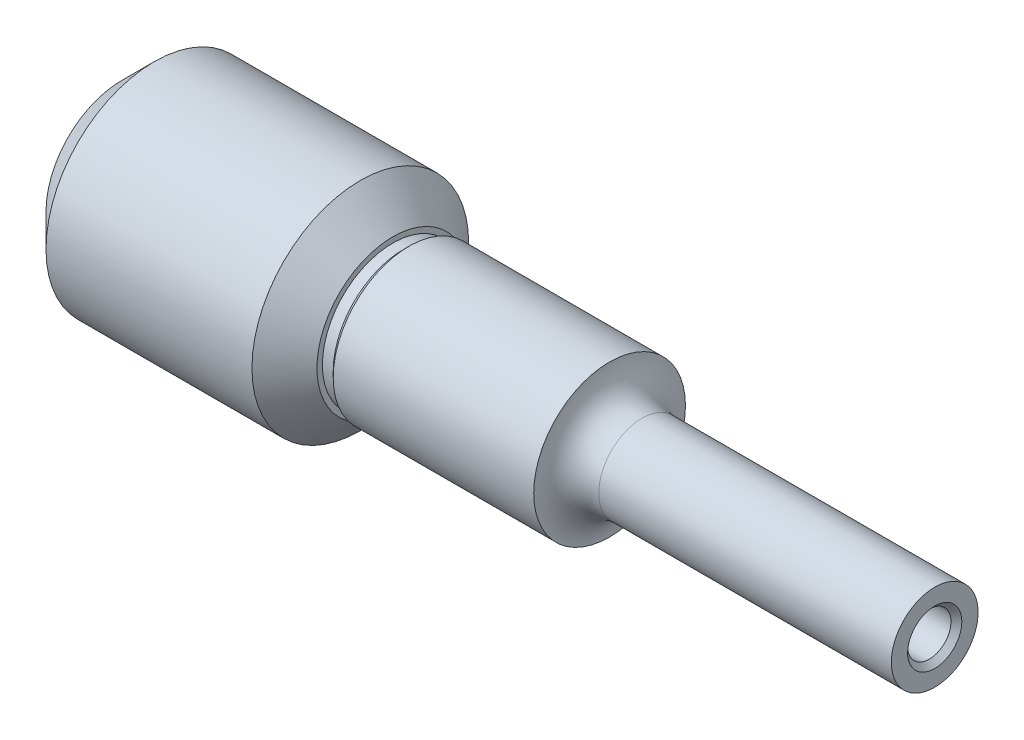
ISO-10303-21;
HEADER;
FILE_DESCRIPTION(('STEP AP214'),'2;1');
FILE_NAME('part.step','',(''),(''),'','','');
FILE_SCHEMA(('AUTOMOTIVE_DESIGN { 1 0 10303 214 1 1 1 1 }'));
ENDSEC;
DATA;
#1=APPLICATION_CONTEXT('core data for automotive mechanical design processes');
#2=APPLICATION_PROTOCOL_DEFINITION('international standard','automotive_design',2000,#1);
#3=PRODUCT_CONTEXT('',#1,'mechanical');
#4=PRODUCT('Part','Part','',(#3));
#5=PRODUCT_RELATED_PRODUCT_CATEGORY('part','',(#4));
#6=PRODUCT_DEFINITION_FORMATION('','',#4);
#7=PRODUCT_DEFINITION_CONTEXT('part definition',#1,'design');
#8=PRODUCT_DEFINITION('design','',#6,#7);
#9=PRODUCT_DEFINITION_SHAPE('','',#8);
#10=(LENGTH_UNIT() NAMED_UNIT(*) SI_UNIT(.MILLI.,.METRE.));
#11=(NAMED_UNIT(*) PLANE_ANGLE_UNIT() SI_UNIT($,.RADIAN.));
#12=(NAMED_UNIT(*) SI_UNIT($,.STERADIAN.) SOLID_ANGLE_UNIT());
#13=UNCERTAINTY_MEASURE_WITH_UNIT(LENGTH_MEASURE(1.E-05),#10,'distance_accuracy_value','');
#14=(GEOMETRIC_REPRESENTATION_CONTEXT(3) GLOBAL_UNCERTAINTY_ASSIGNED_CONTEXT((#13)) GLOBAL_UNIT_ASSIGNED_CONTEXT((#10,
#11,#12)) REPRESENTATION_CONTEXT('',''));
#15=CARTESIAN_POINT('',(0.,0.,0.));
#16=DIRECTION('',(0.,0.,1.));
#17=DIRECTION('',(1.,0.,0.));
#18=AXIS2_PLACEMENT_3D('',#15,#16,#17);
#19=CARTESIAN_POINT('',(96.,0.,0.));
#20=DIRECTION('',(1.,0.,0.));
#21=DIRECTION('',(0.,0.,-1.));
#22=AXIS2_PLACEMENT_3D('',#19,#20,#21);
#23=TOROIDAL_SURFACE('',#22,14.,6.);
#24=CARTESIAN_POINT('',(90.,0.,0.));
#25=DIRECTION('',(-1.,0.,0.));
#26=DIRECTION('',(0.,0.,1.));
#27=AXIS2_PLACEMENT_3D('',#24,#25,#26);
#28=CIRCLE('',#27,14.);
#29=CARTESIAN_POINT('',(90.,0.,14.));
#30=VERTEX_POINT('',#29);
#31=EDGE_CURVE('E78',#30,#30,#28,.T.);
#32=ORIENTED_EDGE('',*,*,#31,.F.);
#33=EDGE_LOOP('',(#32));
#34=FACE_BOUND('',#33,.T.);
#35=CARTESIAN_POINT('',(96.,0.,0.));
#36=DIRECTION('',(1.,0.,0.));
#37=DIRECTION('',(0.,0.,-1.));
#38=AXIS2_PLACEMENT_3D('',#35,#36,#37);
#39=CIRCLE('',#38,8.);
#40=CARTESIAN_POINT('',(96.,0.,-8.));
#41=VERTEX_POINT('',#40);
#42=EDGE_CURVE('E41',#41,#41,#39,.T.);
#43=ORIENTED_EDGE('',*,*,#42,.F.);
#44=EDGE_LOOP('',(#43));
#45=FACE_BOUND('',#44,.T.);
#46=ADVANCED_FACE('F33',(#34,#45),#23,.F.);
#47=CARTESIAN_POINT('',(36.,-10.,0.));
#48=DIRECTION('',(-1.,0.,0.));
#49=DIRECTION('',(0.,0.,1.));
#50=AXIS2_PLACEMENT_3D('',#47,#48,#49);
#51=PLANE('',#50);
#52=CARTESIAN_POINT('',(36.,0.,0.));
#53=DIRECTION('',(-1.,0.,0.));
#54=DIRECTION('',(0.,0.,1.));
#55=AXIS2_PLACEMENT_3D('',#52,#53,#54);
#56=CIRCLE('',#55,10.);
#57=CARTESIAN_POINT('',(36.,0.,10.));
#58=VERTEX_POINT('',#57);
#59=EDGE_CURVE('E87',#58,#58,#56,.T.);
#60=ORIENTED_EDGE('',*,*,#59,.T.);
#61=EDGE_LOOP('',(#60));
#62=FACE_BOUND('',#61,.T.);
#63=ADVANCED_FACE('F91',(#62),#51,.T.);
#64=CARTESIAN_POINT('',(125.,-4.,0.));
#65=DIRECTION('',(1.,0.,0.));
#66=DIRECTION('',(0.,0.,-1.));
#67=AXIS2_PLACEMENT_3D('',#64,#65,#66);
#68=PLANE('',#67);
#69=CARTESIAN_POINT('',(125.,0.,0.));
#70=DIRECTION('',(-1.,0.,0.));
#71=DIRECTION('',(0.,0.,1.));
#72=AXIS2_PLACEMENT_3D('',#69,#70,#71);
#73=CIRCLE('',#72,4.);
#74=CARTESIAN_POINT('',(125.,0.,4.));
#75=VERTEX_POINT('',#74);
#76=EDGE_CURVE('E72',#75,#75,#73,.T.);
#77=ORIENTED_EDGE('',*,*,#76,.F.);
#78=EDGE_LOOP('',(#77));
#79=FACE_BOUND('',#78,.T.);
#80=ADVANCED_FACE('F114',(#79),#68,.T.);
#81=CARTESIAN_POINT('',(0.,0.,0.));
#82=DIRECTION('',(-1.,0.,0.));
#83=DIRECTION('',(0.,0.,1.));
#84=AXIS2_PLACEMENT_3D('',#81,#82,#83);
#85=CYLINDRICAL_SURFACE('',#84,4.);
#86=CARTESIAN_POINT('',(149.,0.,0.));
#87=DIRECTION('',(1.,0.,0.));
#88=DIRECTION('',(0.,0.,-1.));
#89=AXIS2_PLACEMENT_3D('',#86,#87,#88);
#90=CIRCLE('',#89,4.);
#91=CARTESIAN_POINT('',(149.,0.,-4.));
#92=VERTEX_POINT('',#91);
#93=EDGE_CURVE('E45',#92,#92,#90,.T.);
#94=ORIENTED_EDGE('',*,*,#93,.T.);
#95=EDGE_LOOP('',(#94));
#96=FACE_BOUND('',#95,.T.);
#97=ORIENTED_EDGE('',*,*,#76,.T.);
#98=EDGE_LOOP('',(#97));
#99=FACE_BOUND('',#98,.T.);
#100=ADVANCED_FACE('F144',(#96,#99),#85,.F.);
#101=CARTESIAN_POINT('',(150.,-4.,0.));
#102=DIRECTION('',(1.,0.,0.));
#103=DIRECTION('',(0.,0.,-1.));
#104=AXIS2_PLACEMENT_3D('',#101,#102,#103);
#105=PLANE('',#104);
#106=CARTESIAN_POINT('',(150.,0.,0.));
#107=DIRECTION('',(1.,0.,0.));
#108=DIRECTION('',(0.,0.,-1.));
#109=AXIS2_PLACEMENT_3D('',#106,#107,#108);
#110=CIRCLE('',#109,4.99999999999998);
#111=CARTESIAN_POINT('',(150.,0.,-4.99999999999998));
#112=VERTEX_POINT('',#111);
#113=EDGE_CURVE('E49',#112,#112,#110,.F.);
#114=ORIENTED_EDGE('',*,*,#113,.T.);
#115=EDGE_LOOP('',(#114));
#116=FACE_BOUND('',#115,.T.);
#117=CARTESIAN_POINT('',(150.,0.,0.));
#118=DIRECTION('',(-1.,0.,0.));
#119=DIRECTION('',(0.,0.,1.));
#120=AXIS2_PLACEMENT_3D('',#117,#118,#119);
#121=CIRCLE('',#120,8.);
#122=CARTESIAN_POINT('',(150.,0.,8.));
#123=VERTEX_POINT('',#122);
#124=EDGE_CURVE('E75',#123,#123,#121,.T.);
#125=ORIENTED_EDGE('',*,*,#124,.F.);
#126=EDGE_LOOP('',(#125));
#127=FACE_BOUND('',#126,.T.);
#128=ADVANCED_FACE('F148',(#116,#127),#105,.T.);
#129=CARTESIAN_POINT('',(0.,0.,0.));
#130=DIRECTION('',(-1.,0.,0.));
#131=DIRECTION('',(0.,0.,1.));
#132=AXIS2_PLACEMENT_3D('',#129,#130,#131);
#133=CYLINDRICAL_SURFACE('',#132,8.);
#134=ORIENTED_EDGE('',*,*,#42,.T.);
#135=EDGE_LOOP('',(#134));
#136=FACE_BOUND('',#135,.T.);
#137=ORIENTED_EDGE('',*,*,#124,.T.);
#138=EDGE_LOOP('',(#137));
#139=FACE_BOUND('',#138,.T.);
#140=ADVANCED_FACE('F152',(#136,#139),#133,.T.);
#141=CARTESIAN_POINT('',(0.,0.,0.));
#142=DIRECTION('',(-1.,0.,0.));
#143=DIRECTION('',(0.,0.,1.));
#144=AXIS2_PLACEMENT_3D('',#141,#142,#143);
#145=CYLINDRICAL_SURFACE('',#144,14.);
#146=CARTESIAN_POINT('',(53.,0.,0.));
#147=DIRECTION('',(-1.,0.,0.));
#148=DIRECTION('',(0.,0.,1.));
#149=AXIS2_PLACEMENT_3D('',#146,#147,#148);
#150=CIRCLE('',#149,14.);
#151=CARTESIAN_POINT('',(53.,0.,14.));
#152=VERTEX_POINT('',#151);
#153=EDGE_CURVE('E10',#152,#152,#150,.F.);
#154=ORIENTED_EDGE('',*,*,#153,.T.);
#155=EDGE_LOOP('',(#154));
#156=FACE_BOUND('',#155,.T.);
#157=ORIENTED_EDGE('',*,*,#31,.T.);
#158=EDGE_LOOP('',(#157));
#159=FACE_BOUND('',#158,.T.);
#160=ADVANCED_FACE('F156',(#156,#159),#145,.T.);
#161=CARTESIAN_POINT('',(0.,0.,0.));
#162=DIRECTION('',(-1.,0.,0.));
#163=DIRECTION('',(0.,0.,1.));
#164=AXIS2_PLACEMENT_3D('',#161,#162,#163);
#165=CYLINDRICAL_SURFACE('',#164,13.);
#166=CARTESIAN_POINT('',(52.,0.,0.));
#167=DIRECTION('',(-1.,0.,0.));
#168=DIRECTION('',(0.,0.,1.));
#169=AXIS2_PLACEMENT_3D('',#166,#167,#168);
#170=CIRCLE('',#169,13.);
#171=CARTESIAN_POINT('',(52.,0.,13.));
#172=VERTEX_POINT('',#171);
#173=EDGE_CURVE('E81',#172,#172,#170,.T.);
#174=ORIENTED_EDGE('',*,*,#173,.T.);
#175=EDGE_LOOP('',(#174));
#176=FACE_BOUND('',#175,.T.);
#177=CARTESIAN_POINT('',(50.,0.,0.));
#178=DIRECTION('',(-1.,0.,0.));
#179=DIRECTION('',(0.,0.,1.));
#180=AXIS2_PLACEMENT_3D('',#177,#178,#179);
#181=CIRCLE('',#180,13.);
#182=CARTESIAN_POINT('',(50.,0.,13.));
#183=VERTEX_POINT('',#182);
#184=EDGE_CURVE('E84',#183,#183,#181,.T.);
#185=ORIENTED_EDGE('',*,*,#184,.F.);
#186=EDGE_LOOP('',(#185));
#187=FACE_BOUND('',#186,.T.);
#188=ADVANCED_FACE('F159',(#176,#187),#165,.T.);
#189=CARTESIAN_POINT('',(50.,-13.,0.));
#190=DIRECTION('',(1.,0.,0.));
#191=DIRECTION('',(0.,0.,-1.));
#192=AXIS2_PLACEMENT_3D('',#189,#190,#191);
#193=PLANE('',#192);
#194=CARTESIAN_POINT('',(50.,0.,0.));
#195=DIRECTION('',(1.,0.,0.));
#196=DIRECTION('',(0.,0.,-1.));
#197=AXIS2_PLACEMENT_3D('',#194,#195,#196);
#198=CIRCLE('',#197,14.);
#199=CARTESIAN_POINT('',(50.,0.,-14.));
#200=VERTEX_POINT('',#199);
#201=EDGE_CURVE('E63',#200,#200,#198,.T.);
#202=ORIENTED_EDGE('',*,*,#201,.T.);
#203=EDGE_LOOP('',(#202));
#204=FACE_BOUND('',#203,.T.);
#205=ORIENTED_EDGE('',*,*,#184,.T.);
#206=EDGE_LOOP('',(#205));
#207=FACE_BOUND('',#206,.T.);
#208=ADVANCED_FACE('F162',(#204,#207),#193,.T.);
#209=CARTESIAN_POINT('',(0.,0.,0.));
#210=DIRECTION('',(-1.,0.,0.));
#211=DIRECTION('',(0.,0.,1.));
#212=AXIS2_PLACEMENT_3D('',#209,#210,#211);
#213=CYLINDRICAL_SURFACE('',#212,20.);
#214=CARTESIAN_POINT('',(44.,0.,0.));
#215=DIRECTION('',(1.,0.,0.));
#216=DIRECTION('',(0.,0.,-1.));
#217=AXIS2_PLACEMENT_3D('',#214,#215,#216);
#218=CIRCLE('',#217,20.);
#219=CARTESIAN_POINT('',(44.,0.,-20.));
#220=VERTEX_POINT('',#219);
#221=EDGE_CURVE('E66',#220,#220,#218,.F.);
#222=ORIENTED_EDGE('',*,*,#221,.T.);
#223=EDGE_LOOP('',(#222));
#224=FACE_BOUND('',#223,.T.);
#225=CARTESIAN_POINT('',(6.,0.,0.));
#226=DIRECTION('',(-1.,0.,0.));
#227=DIRECTION('',(0.,0.,1.));
#228=AXIS2_PLACEMENT_3D('',#225,#226,#227);
#229=CIRCLE('',#228,20.);
#230=CARTESIAN_POINT('',(6.,0.,20.));
#231=VERTEX_POINT('',#230);
#232=EDGE_CURVE('E69',#231,#231,#229,.F.);
#233=ORIENTED_EDGE('',*,*,#232,.T.);
#234=EDGE_LOOP('',(#233));
#235=FACE_BOUND('',#234,.T.);
#236=ADVANCED_FACE('F106',(#224,#235),#213,.T.);
#237=CARTESIAN_POINT('',(0.,-10.,0.));
#238=DIRECTION('',(-1.,0.,0.));
#239=DIRECTION('',(0.,0.,1.));
#240=AXIS2_PLACEMENT_3D('',#237,#238,#239);
#241=PLANE('',#240);
#242=CARTESIAN_POINT('',(0.,0.,0.));
#243=DIRECTION('',(-1.,0.,0.));
#244=DIRECTION('',(0.,0.,1.));
#245=AXIS2_PLACEMENT_3D('',#242,#243,#244);
#246=CIRCLE('',#245,13.);
#247=CARTESIAN_POINT('',(0.,0.,13.));
#248=VERTEX_POINT('',#247);
#249=EDGE_CURVE('E54',#248,#248,#246,.F.);
#250=ORIENTED_EDGE('',*,*,#249,.T.);
#251=EDGE_LOOP('',(#250));
#252=FACE_BOUND('',#251,.T.);
#253=CARTESIAN_POINT('',(0.,0.,0.));
#254=DIRECTION('',(-1.,0.,0.));
#255=DIRECTION('',(0.,0.,1.));
#256=AXIS2_PLACEMENT_3D('',#253,#254,#255);
#257=CIRCLE('',#256,14.);
#258=CARTESIAN_POINT('',(0.,0.,14.));
#259=VERTEX_POINT('',#258);
#260=EDGE_CURVE('E60',#259,#259,#257,.T.);
#261=ORIENTED_EDGE('',*,*,#260,.T.);
#262=EDGE_LOOP('',(#261));
#263=FACE_BOUND('',#262,.T.);
#264=ADVANCED_FACE('F96',(#252,#263),#241,.T.);
#265=CARTESIAN_POINT('',(0.,0.,0.));
#266=DIRECTION('',(-1.,0.,0.));
#267=DIRECTION('',(0.,0.,1.));
#268=AXIS2_PLACEMENT_3D('',#265,#266,#267);
#269=CYLINDRICAL_SURFACE('',#268,10.);
#270=CARTESIAN_POINT('',(3.00000000000002,0.,0.));
#271=DIRECTION('',(-1.,0.,0.));
#272=DIRECTION('',(0.,0.,1.));
#273=AXIS2_PLACEMENT_3D('',#270,#271,#272);
#274=CIRCLE('',#273,10.);
#275=CARTESIAN_POINT('',(3.00000000000002,0.,10.));
#276=VERTEX_POINT('',#275);
#277=EDGE_CURVE('E57',#276,#276,#274,.T.);
#278=ORIENTED_EDGE('',*,*,#277,.T.);
#279=EDGE_LOOP('',(#278));
#280=FACE_BOUND('',#279,.T.);
#281=ORIENTED_EDGE('',*,*,#59,.F.);
#282=EDGE_LOOP('',(#281));
#283=FACE_BOUND('',#282,.T.);
#284=ADVANCED_FACE('F93',(#280,#283),#269,.F.);
#285=CARTESIAN_POINT('',(44.,0.,0.));
#286=DIRECTION('',(-1.,0.,0.));
#287=DIRECTION('',(0.,0.,1.));
#288=AXIS2_PLACEMENT_3D('',#285,#286,#287);
#289=CONICAL_SURFACE('',#288,20.,0.78539816339745);
#290=ORIENTED_EDGE('',*,*,#201,.F.);
#291=EDGE_LOOP('',(#290));
#292=FACE_BOUND('',#291,.T.);
#293=ORIENTED_EDGE('',*,*,#221,.F.);
#294=EDGE_LOOP('',(#293));
#295=FACE_BOUND('',#294,.T.);
#296=ADVANCED_FACE('F95',(#292,#295),#289,.T.);
#297=CARTESIAN_POINT('',(0.,0.,0.));
#298=DIRECTION('',(1.,0.,0.));
#299=DIRECTION('',(0.,0.,-1.));
#300=AXIS2_PLACEMENT_3D('',#297,#298,#299);
#301=CONICAL_SURFACE('',#300,14.,0.785398163397445);
#302=ORIENTED_EDGE('',*,*,#232,.F.);
#303=EDGE_LOOP('',(#302));
#304=FACE_BOUND('',#303,.T.);
#305=ORIENTED_EDGE('',*,*,#260,.F.);
#306=EDGE_LOOP('',(#305));
#307=FACE_BOUND('',#306,.T.);
#308=ADVANCED_FACE('F103',(#304,#307),#301,.T.);
#309=CARTESIAN_POINT('',(3.00000000000002,0.,0.));
#310=DIRECTION('',(-1.,0.,0.));
#311=DIRECTION('',(0.,0.,1.));
#312=AXIS2_PLACEMENT_3D('',#309,#310,#311);
#313=CONICAL_SURFACE('',#312,10.,0.785398163397452);
#314=ORIENTED_EDGE('',*,*,#249,.F.);
#315=EDGE_LOOP('',(#314));
#316=FACE_BOUND('',#315,.T.);
#317=ORIENTED_EDGE('',*,*,#277,.F.);
#318=EDGE_LOOP('',(#317));
#319=FACE_BOUND('',#318,.T.);
#320=ADVANCED_FACE('F126',(#316,#319),#313,.F.);
#321=CARTESIAN_POINT('',(150.,0.,0.));
#322=DIRECTION('',(1.,0.,0.));
#323=DIRECTION('',(0.,0.,-1.));
#324=AXIS2_PLACEMENT_3D('',#321,#322,#323);
#325=CONICAL_SURFACE('',#324,4.99999999999998,0.78539816339745);
#326=ORIENTED_EDGE('',*,*,#93,.F.);
#327=EDGE_LOOP('',(#326));
#328=FACE_BOUND('',#327,.T.);
#329=ORIENTED_EDGE('',*,*,#113,.F.);
#330=EDGE_LOOP('',(#329));
#331=FACE_BOUND('',#330,.T.);
#332=ADVANCED_FACE('F120',(#328,#331),#325,.F.);
#333=CARTESIAN_POINT('',(52.,0.,0.));
#334=DIRECTION('',(1.,0.,0.));
#335=DIRECTION('',(0.,0.,-1.));
#336=AXIS2_PLACEMENT_3D('',#333,#334,#335);
#337=CONICAL_SURFACE('',#336,13.,0.785398163397446);
#338=ORIENTED_EDGE('',*,*,#153,.F.);
#339=EDGE_LOOP('',(#338));
#340=FACE_BOUND('',#339,.T.);
#341=ORIENTED_EDGE('',*,*,#173,.F.);
#342=EDGE_LOOP('',(#341));
#343=FACE_BOUND('',#342,.T.);
#344=ADVANCED_FACE('F36',(#340,#343),#337,.T.);
#345=CLOSED_SHELL('',(#46,#63,#80,#100,#128,#140,#160,#188,#208,#236,#264,#284,#296,#308,#320,
#332,#344));
#346=MANIFOLD_SOLID_BREP('B2',#345);
#347=ADVANCED_BREP_SHAPE_REPRESENTATION('',(#18,#346),#14);
#348=SHAPE_DEFINITION_REPRESENTATION(#9,#347);
ENDSEC;
END-ISO-10303-21;
